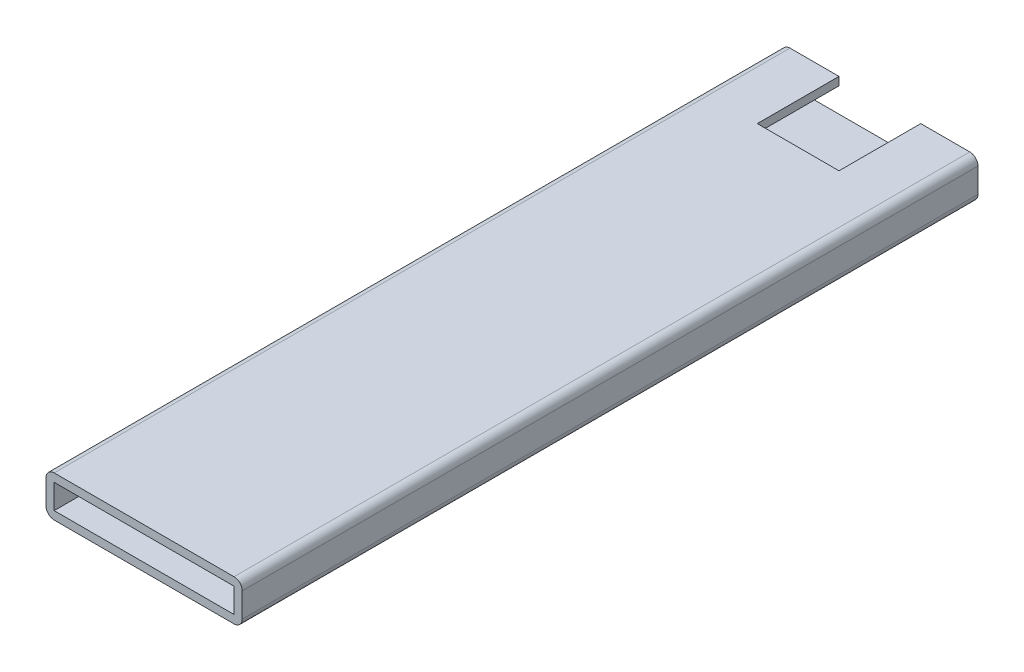
ISO-10303-21;
HEADER;
FILE_DESCRIPTION(('STEP AP214'),'2;1');
FILE_NAME('part.step','',(''),(''),'','','');
FILE_SCHEMA(('AUTOMOTIVE_DESIGN { 1 0 10303 214 1 1 1 1 }'));
ENDSEC;
DATA;
#1=APPLICATION_CONTEXT('core data for automotive mechanical design processes');
#2=APPLICATION_PROTOCOL_DEFINITION('international standard','automotive_design',2000,#1);
#3=PRODUCT_CONTEXT('',#1,'mechanical');
#4=PRODUCT('Part','Part','',(#3));
#5=PRODUCT_RELATED_PRODUCT_CATEGORY('part','',(#4));
#6=PRODUCT_DEFINITION_FORMATION('','',#4);
#7=PRODUCT_DEFINITION_CONTEXT('part definition',#1,'design');
#8=PRODUCT_DEFINITION('design','',#6,#7);
#9=PRODUCT_DEFINITION_SHAPE('','',#8);
#10=(LENGTH_UNIT() NAMED_UNIT(*) SI_UNIT(.MILLI.,.METRE.));
#11=(NAMED_UNIT(*) PLANE_ANGLE_UNIT() SI_UNIT($,.RADIAN.));
#12=(NAMED_UNIT(*) SI_UNIT($,.STERADIAN.) SOLID_ANGLE_UNIT());
#13=UNCERTAINTY_MEASURE_WITH_UNIT(LENGTH_MEASURE(1.E-05),#10,'distance_accuracy_value','');
#14=(GEOMETRIC_REPRESENTATION_CONTEXT(3) GLOBAL_UNCERTAINTY_ASSIGNED_CONTEXT((#13)) GLOBAL_UNIT_ASSIGNED_CONTEXT((#10,
#11,#12)) REPRESENTATION_CONTEXT('',''));
#15=CARTESIAN_POINT('',(0.,0.,0.));
#16=DIRECTION('',(0.,0.,1.));
#17=DIRECTION('',(1.,0.,0.));
#18=AXIS2_PLACEMENT_3D('',#15,#16,#17);
#19=CARTESIAN_POINT('',(22.,0.,90.));
#20=DIRECTION('',(0.,0.,1.));
#21=DIRECTION('',(1.,0.,0.));
#22=AXIS2_PLACEMENT_3D('',#19,#20,#21);
#23=PLANE('',#22);
#24=CARTESIAN_POINT('',(22.,0.,90.));
#25=DIRECTION('',(0.,0.,1.));
#26=DIRECTION('',(1.,0.,0.));
#27=AXIS2_PLACEMENT_3D('',#24,#25,#26);
#28=CIRCLE('',#27,1.);
#29=CARTESIAN_POINT('',(22.,-1.,90.));
#30=VERTEX_POINT('',#29);
#31=CARTESIAN_POINT('',(23.,0.,90.));
#32=VERTEX_POINT('',#31);
#33=EDGE_CURVE('E209',#30,#32,#28,.T.);
#34=ORIENTED_EDGE('',*,*,#33,.T.);
#35=DIRECTION('',(0.,1.,0.));
#36=VECTOR('',#35,1.);
#37=CARTESIAN_POINT('',(23.,2.99999999999999,90.));
#38=LINE('',#37,#36);
#39=CARTESIAN_POINT('',(23.,2.99999999999999,90.));
#40=VERTEX_POINT('',#39);
#41=EDGE_CURVE('E213',#32,#40,#38,.T.);
#42=ORIENTED_EDGE('',*,*,#41,.T.);
#43=CARTESIAN_POINT('',(22.,3.,90.));
#44=DIRECTION('',(0.,0.,1.));
#45=DIRECTION('',(-1.,0.,0.));
#46=AXIS2_PLACEMENT_3D('',#43,#44,#45);
#47=CIRCLE('',#46,1.);
#48=CARTESIAN_POINT('',(22.,4.,90.));
#49=VERTEX_POINT('',#48);
#50=EDGE_CURVE('E217',#40,#49,#47,.T.);
#51=ORIENTED_EDGE('',*,*,#50,.T.);
#52=DIRECTION('',(-1.,0.,0.));
#53=VECTOR('',#52,1.);
#54=CARTESIAN_POINT('',(0.,4.,90.));
#55=LINE('',#54,#53);
#56=CARTESIAN_POINT('',(0.,4.,90.));
#57=VERTEX_POINT('',#56);
#58=EDGE_CURVE('E220',#49,#57,#55,.T.);
#59=ORIENTED_EDGE('',*,*,#58,.T.);
#60=CARTESIAN_POINT('',(0.,3.,90.));
#61=DIRECTION('',(0.,0.,1.));
#62=DIRECTION('',(1.,0.,0.));
#63=AXIS2_PLACEMENT_3D('',#60,#61,#62);
#64=CIRCLE('',#63,1.);
#65=CARTESIAN_POINT('',(-1.,2.99999999999999,90.));
#66=VERTEX_POINT('',#65);
#67=EDGE_CURVE('E223',#57,#66,#64,.T.);
#68=ORIENTED_EDGE('',*,*,#67,.T.);
#69=DIRECTION('',(0.,-1.,0.));
#70=VECTOR('',#69,1.);
#71=CARTESIAN_POINT('',(-1.,2.99999999999999,90.));
#72=LINE('',#71,#70);
#73=CARTESIAN_POINT('',(-1.,0.,90.));
#74=VERTEX_POINT('',#73);
#75=EDGE_CURVE('E226',#66,#74,#72,.T.);
#76=ORIENTED_EDGE('',*,*,#75,.T.);
#77=CARTESIAN_POINT('',(0.,0.,90.));
#78=DIRECTION('',(0.,0.,1.));
#79=DIRECTION('',(1.,0.,0.));
#80=AXIS2_PLACEMENT_3D('',#77,#78,#79);
#81=CIRCLE('',#80,1.);
#82=CARTESIAN_POINT('',(0.,-1.,90.));
#83=VERTEX_POINT('',#82);
#84=EDGE_CURVE('E229',#74,#83,#81,.T.);
#85=ORIENTED_EDGE('',*,*,#84,.T.);
#86=DIRECTION('',(1.,0.,0.));
#87=VECTOR('',#86,1.);
#88=CARTESIAN_POINT('',(0.,-1.,90.));
#89=LINE('',#88,#87);
#90=EDGE_CURVE('E232',#83,#30,#89,.T.);
#91=ORIENTED_EDGE('',*,*,#90,.T.);
#92=EDGE_LOOP('',(#34,#42,#51,#59,#68,#76,#85,#91));
#93=FACE_BOUND('',#92,.T.);
#94=DIRECTION('',(1.,0.,0.));
#95=VECTOR('',#94,1.);
#96=CARTESIAN_POINT('',(0.,0.,90.));
#97=LINE('',#96,#95);
#98=CARTESIAN_POINT('',(0.,0.,90.));
#99=VERTEX_POINT('',#98);
#100=CARTESIAN_POINT('',(22.,0.,90.));
#101=VERTEX_POINT('',#100);
#102=EDGE_CURVE('E525',#99,#101,#97,.T.);
#103=ORIENTED_EDGE('',*,*,#102,.F.);
#104=DIRECTION('',(0.,-1.,0.));
#105=VECTOR('',#104,1.);
#106=CARTESIAN_POINT('',(0.,0.,90.));
#107=LINE('',#106,#105);
#108=CARTESIAN_POINT('',(0.,3.,90.));
#109=VERTEX_POINT('',#108);
#110=EDGE_CURVE('E190',#109,#99,#107,.T.);
#111=ORIENTED_EDGE('',*,*,#110,.F.);
#112=DIRECTION('',(-1.,0.,0.));
#113=VECTOR('',#112,1.);
#114=CARTESIAN_POINT('',(0.,3.,90.));
#115=LINE('',#114,#113);
#116=CARTESIAN_POINT('',(22.,3.,90.));
#117=VERTEX_POINT('',#116);
#118=EDGE_CURVE('E198',#117,#109,#115,.T.);
#119=ORIENTED_EDGE('',*,*,#118,.F.);
#120=DIRECTION('',(0.,1.,0.));
#121=VECTOR('',#120,1.);
#122=CARTESIAN_POINT('',(22.,0.,90.));
#123=LINE('',#122,#121);
#124=EDGE_CURVE('E528',#101,#117,#123,.T.);
#125=ORIENTED_EDGE('',*,*,#124,.F.);
#126=EDGE_LOOP('',(#103,#111,#119,#125));
#127=FACE_BOUND('',#126,.T.);
#128=ADVANCED_FACE('F43',(#93,#127),#23,.T.);
#129=CARTESIAN_POINT('',(22.,0.,0.));
#130=DIRECTION('',(0.,0.,1.));
#131=DIRECTION('',(1.,0.,0.));
#132=AXIS2_PLACEMENT_3D('',#129,#130,#131);
#133=PLANE('',#132);
#134=DIRECTION('',(-1.,0.,0.));
#135=VECTOR('',#134,1.);
#136=CARTESIAN_POINT('',(0.,3.,0.));
#137=LINE('',#136,#135);
#138=CARTESIAN_POINT('',(22.,3.,0.));
#139=VERTEX_POINT('',#138);
#140=CARTESIAN_POINT('',(16.,3.,0.));
#141=VERTEX_POINT('',#140);
#142=EDGE_CURVE('E185',#139,#141,#137,.T.);
#143=ORIENTED_EDGE('',*,*,#142,.T.);
#144=DIRECTION('',(0.,1.,0.));
#145=VECTOR('',#144,1.);
#146=CARTESIAN_POINT('',(16.,3.,0.));
#147=LINE('',#146,#145);
#148=CARTESIAN_POINT('',(16.,4.,0.));
#149=VERTEX_POINT('',#148);
#150=EDGE_CURVE('E294',#141,#149,#147,.T.);
#151=ORIENTED_EDGE('',*,*,#150,.T.);
#152=DIRECTION('',(-1.,0.,0.));
#153=VECTOR('',#152,1.);
#154=CARTESIAN_POINT('',(0.,4.,0.));
#155=LINE('',#154,#153);
#156=CARTESIAN_POINT('',(22.,4.,0.));
#157=VERTEX_POINT('',#156);
#158=EDGE_CURVE('E245',#157,#149,#155,.T.);
#159=ORIENTED_EDGE('',*,*,#158,.F.);
#160=CARTESIAN_POINT('',(22.,3.,0.));
#161=DIRECTION('',(0.,0.,1.));
#162=DIRECTION('',(-1.,0.,0.));
#163=AXIS2_PLACEMENT_3D('',#160,#161,#162);
#164=CIRCLE('',#163,1.);
#165=CARTESIAN_POINT('',(23.,2.99999999999999,0.));
#166=VERTEX_POINT('',#165);
#167=EDGE_CURVE('E242',#166,#157,#164,.T.);
#168=ORIENTED_EDGE('',*,*,#167,.F.);
#169=DIRECTION('',(0.,1.,0.));
#170=VECTOR('',#169,1.);
#171=CARTESIAN_POINT('',(23.,2.99999999999999,0.));
#172=LINE('',#171,#170);
#173=CARTESIAN_POINT('',(23.,0.,0.));
#174=VERTEX_POINT('',#173);
#175=EDGE_CURVE('E239',#174,#166,#172,.T.);
#176=ORIENTED_EDGE('',*,*,#175,.F.);
#177=CARTESIAN_POINT('',(22.,0.,0.));
#178=DIRECTION('',(0.,0.,1.));
#179=DIRECTION('',(1.,0.,0.));
#180=AXIS2_PLACEMENT_3D('',#177,#178,#179);
#181=CIRCLE('',#180,1.);
#182=CARTESIAN_POINT('',(22.,-1.,0.));
#183=VERTEX_POINT('',#182);
#184=EDGE_CURVE('E208',#183,#174,#181,.T.);
#185=ORIENTED_EDGE('',*,*,#184,.F.);
#186=DIRECTION('',(1.,0.,0.));
#187=VECTOR('',#186,1.);
#188=CARTESIAN_POINT('',(0.,-1.,0.));
#189=LINE('',#188,#187);
#190=CARTESIAN_POINT('',(0.,-1.,0.));
#191=VERTEX_POINT('',#190);
#192=EDGE_CURVE('E214',#191,#183,#189,.T.);
#193=ORIENTED_EDGE('',*,*,#192,.F.);
#194=CARTESIAN_POINT('',(0.,0.,0.));
#195=DIRECTION('',(0.,0.,1.));
#196=DIRECTION('',(1.,0.,0.));
#197=AXIS2_PLACEMENT_3D('',#194,#195,#196);
#198=CIRCLE('',#197,1.);
#199=CARTESIAN_POINT('',(-1.,0.,0.));
#200=VERTEX_POINT('',#199);
#201=EDGE_CURVE('E255',#200,#191,#198,.T.);
#202=ORIENTED_EDGE('',*,*,#201,.F.);
#203=DIRECTION('',(0.,-1.,0.));
#204=VECTOR('',#203,1.);
#205=CARTESIAN_POINT('',(-1.,2.99999999999999,0.));
#206=LINE('',#205,#204);
#207=CARTESIAN_POINT('',(-1.,2.99999999999999,0.));
#208=VERTEX_POINT('',#207);
#209=EDGE_CURVE('E252',#208,#200,#206,.T.);
#210=ORIENTED_EDGE('',*,*,#209,.F.);
#211=CARTESIAN_POINT('',(0.,3.,0.));
#212=DIRECTION('',(0.,0.,1.));
#213=DIRECTION('',(1.,0.,0.));
#214=AXIS2_PLACEMENT_3D('',#211,#212,#213);
#215=CIRCLE('',#214,1.);
#216=CARTESIAN_POINT('',(0.,4.,0.));
#217=VERTEX_POINT('',#216);
#218=EDGE_CURVE('E249',#217,#208,#215,.T.);
#219=ORIENTED_EDGE('',*,*,#218,.F.);
#220=CARTESIAN_POINT('',(6.00000000000001,4.,0.));
#221=VERTEX_POINT('',#220);
#222=EDGE_CURVE('E175',#221,#217,#155,.T.);
#223=ORIENTED_EDGE('',*,*,#222,.F.);
#224=DIRECTION('',(0.,1.,0.));
#225=VECTOR('',#224,1.);
#226=CARTESIAN_POINT('',(6.00000000000001,3.,0.));
#227=LINE('',#226,#225);
#228=CARTESIAN_POINT('',(6.00000000000001,3.,0.));
#229=VERTEX_POINT('',#228);
#230=EDGE_CURVE('E160',#229,#221,#227,.T.);
#231=ORIENTED_EDGE('',*,*,#230,.F.);
#232=CARTESIAN_POINT('',(0.,3.,0.));
#233=VERTEX_POINT('',#232);
#234=EDGE_CURVE('E172',#229,#233,#137,.T.);
#235=ORIENTED_EDGE('',*,*,#234,.T.);
#236=DIRECTION('',(0.,-1.,0.));
#237=VECTOR('',#236,1.);
#238=CARTESIAN_POINT('',(0.,0.,0.));
#239=LINE('',#238,#237);
#240=CARTESIAN_POINT('',(0.,0.,0.));
#241=VERTEX_POINT('',#240);
#242=EDGE_CURVE('E518',#233,#241,#239,.T.);
#243=ORIENTED_EDGE('',*,*,#242,.T.);
#244=DIRECTION('',(1.,0.,0.));
#245=VECTOR('',#244,1.);
#246=CARTESIAN_POINT('',(0.,0.,0.));
#247=LINE('',#246,#245);
#248=CARTESIAN_POINT('',(22.,0.,0.));
#249=VERTEX_POINT('',#248);
#250=EDGE_CURVE('E192',#241,#249,#247,.T.);
#251=ORIENTED_EDGE('',*,*,#250,.T.);
#252=DIRECTION('',(0.,1.,0.));
#253=VECTOR('',#252,1.);
#254=CARTESIAN_POINT('',(22.,0.,0.));
#255=LINE('',#254,#253);
#256=EDGE_CURVE('E186',#249,#139,#255,.T.);
#257=ORIENTED_EDGE('',*,*,#256,.T.);
#258=EDGE_LOOP('',(#143,#151,#159,#168,#176,#185,#193,#202,#210,#219,#223,#231,#235,#243,#251,#257));
#259=FACE_BOUND('',#258,.T.);
#260=ADVANCED_FACE('F170',(#259),#133,.F.);
#261=CARTESIAN_POINT('',(22.,0.,90.));
#262=DIRECTION('',(0.,0.,-1.));
#263=DIRECTION('',(-1.,0.,0.));
#264=AXIS2_PLACEMENT_3D('',#261,#262,#263);
#265=CYLINDRICAL_SURFACE('',#264,1.);
#266=ORIENTED_EDGE('',*,*,#184,.T.);
#267=DIRECTION('',(0.,0.,-1.));
#268=VECTOR('',#267,1.);
#269=CARTESIAN_POINT('',(23.,0.,90.));
#270=LINE('',#269,#268);
#271=EDGE_CURVE('E11',#32,#174,#270,.T.);
#272=ORIENTED_EDGE('',*,*,#271,.F.);
#273=ORIENTED_EDGE('',*,*,#33,.F.);
#274=DIRECTION('',(0.,0.,-1.));
#275=VECTOR('',#274,1.);
#276=CARTESIAN_POINT('',(22.,-1.,90.));
#277=LINE('',#276,#275);
#278=EDGE_CURVE('E235',#30,#183,#277,.T.);
#279=ORIENTED_EDGE('',*,*,#278,.T.);
#280=EDGE_LOOP('',(#266,#272,#273,#279));
#281=FACE_BOUND('',#280,.T.);
#282=ADVANCED_FACE('F45',(#281),#265,.T.);
#283=CARTESIAN_POINT('',(23.,2.99999999999999,90.));
#284=DIRECTION('',(-1.,0.,0.));
#285=DIRECTION('',(0.,-1.,0.));
#286=AXIS2_PLACEMENT_3D('',#283,#284,#285);
#287=PLANE('',#286);
#288=ORIENTED_EDGE('',*,*,#175,.T.);
#289=DIRECTION('',(0.,0.,-1.));
#290=VECTOR('',#289,1.);
#291=CARTESIAN_POINT('',(23.,2.99999999999999,90.));
#292=LINE('',#291,#290);
#293=EDGE_CURVE('E52',#40,#166,#292,.T.);
#294=ORIENTED_EDGE('',*,*,#293,.F.);
#295=ORIENTED_EDGE('',*,*,#41,.F.);
#296=ORIENTED_EDGE('',*,*,#271,.T.);
#297=EDGE_LOOP('',(#288,#294,#295,#296));
#298=FACE_BOUND('',#297,.T.);
#299=ADVANCED_FACE('F307',(#298),#287,.F.);
#300=CARTESIAN_POINT('',(22.,3.,90.));
#301=DIRECTION('',(0.,0.,-1.));
#302=DIRECTION('',(-1.,0.,0.));
#303=AXIS2_PLACEMENT_3D('',#300,#301,#302);
#304=CYLINDRICAL_SURFACE('',#303,1.);
#305=ORIENTED_EDGE('',*,*,#167,.T.);
#306=DIRECTION('',(0.,0.,-1.));
#307=VECTOR('',#306,1.);
#308=CARTESIAN_POINT('',(22.,4.,90.));
#309=LINE('',#308,#307);
#310=EDGE_CURVE('E279',#49,#157,#309,.T.);
#311=ORIENTED_EDGE('',*,*,#310,.F.);
#312=ORIENTED_EDGE('',*,*,#50,.F.);
#313=ORIENTED_EDGE('',*,*,#293,.T.);
#314=EDGE_LOOP('',(#305,#311,#312,#313));
#315=FACE_BOUND('',#314,.T.);
#316=ADVANCED_FACE('F288',(#315),#304,.T.);
#317=CARTESIAN_POINT('',(0.,4.,90.));
#318=DIRECTION('',(0.,-1.,0.));
#319=DIRECTION('',(0.,0.,-1.));
#320=AXIS2_PLACEMENT_3D('',#317,#318,#319);
#321=PLANE('',#320);
#322=ORIENTED_EDGE('',*,*,#158,.T.);
#323=DIRECTION('',(0.,0.,-1.));
#324=VECTOR('',#323,1.);
#325=CARTESIAN_POINT('',(16.,4.,10.));
#326=LINE('',#325,#324);
#327=CARTESIAN_POINT('',(16.,4.,10.));
#328=VERTEX_POINT('',#327);
#329=EDGE_CURVE('E165',#328,#149,#326,.T.);
#330=ORIENTED_EDGE('',*,*,#329,.F.);
#331=DIRECTION('',(1.,0.,0.));
#332=VECTOR('',#331,1.);
#333=CARTESIAN_POINT('',(6.00000000000001,4.,10.));
#334=LINE('',#333,#332);
#335=CARTESIAN_POINT('',(6.00000000000001,4.,10.));
#336=VERTEX_POINT('',#335);
#337=EDGE_CURVE('E504',#336,#328,#334,.T.);
#338=ORIENTED_EDGE('',*,*,#337,.F.);
#339=DIRECTION('',(0.,0.,1.));
#340=VECTOR('',#339,1.);
#341=CARTESIAN_POINT('',(6.00000000000001,4.,0.));
#342=LINE('',#341,#340);
#343=EDGE_CURVE('E508',#221,#336,#342,.T.);
#344=ORIENTED_EDGE('',*,*,#343,.F.);
#345=ORIENTED_EDGE('',*,*,#222,.T.);
#346=DIRECTION('',(0.,0.,-1.));
#347=VECTOR('',#346,1.);
#348=CARTESIAN_POINT('',(0.,4.,90.));
#349=LINE('',#348,#347);
#350=EDGE_CURVE('E275',#57,#217,#349,.T.);
#351=ORIENTED_EDGE('',*,*,#350,.F.);
#352=ORIENTED_EDGE('',*,*,#58,.F.);
#353=ORIENTED_EDGE('',*,*,#310,.T.);
#354=EDGE_LOOP('',(#322,#330,#338,#344,#345,#351,#352,#353));
#355=FACE_BOUND('',#354,.T.);
#356=ADVANCED_FACE('F297',(#355),#321,.F.);
#357=CARTESIAN_POINT('',(0.,3.,90.));
#358=DIRECTION('',(0.,0.,-1.));
#359=DIRECTION('',(-1.,0.,0.));
#360=AXIS2_PLACEMENT_3D('',#357,#358,#359);
#361=CYLINDRICAL_SURFACE('',#360,1.);
#362=ORIENTED_EDGE('',*,*,#218,.T.);
#363=DIRECTION('',(0.,0.,-1.));
#364=VECTOR('',#363,1.);
#365=CARTESIAN_POINT('',(-1.,2.99999999999999,90.));
#366=LINE('',#365,#364);
#367=EDGE_CURVE('E271',#66,#208,#366,.T.);
#368=ORIENTED_EDGE('',*,*,#367,.F.);
#369=ORIENTED_EDGE('',*,*,#67,.F.);
#370=ORIENTED_EDGE('',*,*,#350,.T.);
#371=EDGE_LOOP('',(#362,#368,#369,#370));
#372=FACE_BOUND('',#371,.T.);
#373=ADVANCED_FACE('F325',(#372),#361,.T.);
#374=CARTESIAN_POINT('',(-1.,2.99999999999999,90.));
#375=DIRECTION('',(1.,0.,0.));
#376=DIRECTION('',(0.,1.,0.));
#377=AXIS2_PLACEMENT_3D('',#374,#375,#376);
#378=PLANE('',#377);
#379=ORIENTED_EDGE('',*,*,#209,.T.);
#380=DIRECTION('',(0.,0.,-1.));
#381=VECTOR('',#380,1.);
#382=CARTESIAN_POINT('',(-1.,0.,90.));
#383=LINE('',#382,#381);
#384=EDGE_CURVE('E267',#74,#200,#383,.T.);
#385=ORIENTED_EDGE('',*,*,#384,.F.);
#386=ORIENTED_EDGE('',*,*,#75,.F.);
#387=ORIENTED_EDGE('',*,*,#367,.T.);
#388=EDGE_LOOP('',(#379,#385,#386,#387));
#389=FACE_BOUND('',#388,.T.);
#390=ADVANCED_FACE('F323',(#389),#378,.F.);
#391=CARTESIAN_POINT('',(0.,0.,90.));
#392=DIRECTION('',(0.,0.,-1.));
#393=DIRECTION('',(-1.,0.,0.));
#394=AXIS2_PLACEMENT_3D('',#391,#392,#393);
#395=CYLINDRICAL_SURFACE('',#394,1.);
#396=ORIENTED_EDGE('',*,*,#201,.T.);
#397=DIRECTION('',(0.,0.,-1.));
#398=VECTOR('',#397,1.);
#399=CARTESIAN_POINT('',(0.,-1.,90.));
#400=LINE('',#399,#398);
#401=EDGE_CURVE('E263',#83,#191,#400,.T.);
#402=ORIENTED_EDGE('',*,*,#401,.F.);
#403=ORIENTED_EDGE('',*,*,#84,.F.);
#404=ORIENTED_EDGE('',*,*,#384,.T.);
#405=EDGE_LOOP('',(#396,#402,#403,#404));
#406=FACE_BOUND('',#405,.T.);
#407=ADVANCED_FACE('F319',(#406),#395,.T.);
#408=CARTESIAN_POINT('',(0.,-1.,90.));
#409=DIRECTION('',(0.,1.,0.));
#410=DIRECTION('',(0.,0.,1.));
#411=AXIS2_PLACEMENT_3D('',#408,#409,#410);
#412=PLANE('',#411);
#413=ORIENTED_EDGE('',*,*,#192,.T.);
#414=ORIENTED_EDGE('',*,*,#278,.F.);
#415=ORIENTED_EDGE('',*,*,#90,.F.);
#416=ORIENTED_EDGE('',*,*,#401,.T.);
#417=EDGE_LOOP('',(#413,#414,#415,#416));
#418=FACE_BOUND('',#417,.T.);
#419=ADVANCED_FACE('F314',(#418),#412,.F.);
#420=CARTESIAN_POINT('',(0.,0.,90.));
#421=DIRECTION('',(1.,0.,0.));
#422=DIRECTION('',(0.,0.,-1.));
#423=AXIS2_PLACEMENT_3D('',#420,#421,#422);
#424=PLANE('',#423);
#425=ORIENTED_EDGE('',*,*,#242,.F.);
#426=DIRECTION('',(0.,0.,-1.));
#427=VECTOR('',#426,1.);
#428=CARTESIAN_POINT('',(0.,3.,90.));
#429=LINE('',#428,#427);
#430=EDGE_CURVE('E183',#109,#233,#429,.T.);
#431=ORIENTED_EDGE('',*,*,#430,.F.);
#432=ORIENTED_EDGE('',*,*,#110,.T.);
#433=DIRECTION('',(0.,0.,-1.));
#434=VECTOR('',#433,1.);
#435=CARTESIAN_POINT('',(0.,0.,90.));
#436=LINE('',#435,#434);
#437=EDGE_CURVE('E204',#99,#241,#436,.T.);
#438=ORIENTED_EDGE('',*,*,#437,.T.);
#439=EDGE_LOOP('',(#425,#431,#432,#438));
#440=FACE_BOUND('',#439,.T.);
#441=ADVANCED_FACE('F341',(#440),#424,.T.);
#442=CARTESIAN_POINT('',(0.,0.,90.));
#443=DIRECTION('',(0.,1.,0.));
#444=DIRECTION('',(0.,0.,1.));
#445=AXIS2_PLACEMENT_3D('',#442,#443,#444);
#446=PLANE('',#445);
#447=ORIENTED_EDGE('',*,*,#250,.F.);
#448=ORIENTED_EDGE('',*,*,#437,.F.);
#449=ORIENTED_EDGE('',*,*,#102,.T.);
#450=DIRECTION('',(0.,0.,-1.));
#451=VECTOR('',#450,1.);
#452=CARTESIAN_POINT('',(22.,0.,90.));
#453=LINE('',#452,#451);
#454=EDGE_CURVE('E201',#101,#249,#453,.T.);
#455=ORIENTED_EDGE('',*,*,#454,.T.);
#456=EDGE_LOOP('',(#447,#448,#449,#455));
#457=FACE_BOUND('',#456,.T.);
#458=ADVANCED_FACE('F361',(#457),#446,.T.);
#459=CARTESIAN_POINT('',(22.,0.,90.));
#460=DIRECTION('',(-1.,0.,0.));
#461=DIRECTION('',(0.,0.,1.));
#462=AXIS2_PLACEMENT_3D('',#459,#460,#461);
#463=PLANE('',#462);
#464=ORIENTED_EDGE('',*,*,#256,.F.);
#465=ORIENTED_EDGE('',*,*,#454,.F.);
#466=ORIENTED_EDGE('',*,*,#124,.T.);
#467=DIRECTION('',(0.,0.,-1.));
#468=VECTOR('',#467,1.);
#469=CARTESIAN_POINT('',(22.,3.,90.));
#470=LINE('',#469,#468);
#471=EDGE_CURVE('E67',#117,#139,#470,.T.);
#472=ORIENTED_EDGE('',*,*,#471,.T.);
#473=EDGE_LOOP('',(#464,#465,#466,#472));
#474=FACE_BOUND('',#473,.T.);
#475=ADVANCED_FACE('F368',(#474),#463,.T.);
#476=CARTESIAN_POINT('',(0.,3.,90.));
#477=DIRECTION('',(0.,-1.,0.));
#478=DIRECTION('',(0.,0.,-1.));
#479=AXIS2_PLACEMENT_3D('',#476,#477,#478);
#480=PLANE('',#479);
#481=DIRECTION('',(0.,0.,-1.));
#482=VECTOR('',#481,1.);
#483=CARTESIAN_POINT('',(16.,3.,10.));
#484=LINE('',#483,#482);
#485=CARTESIAN_POINT('',(16.,3.,10.));
#486=VERTEX_POINT('',#485);
#487=EDGE_CURVE('E177',#486,#141,#484,.T.);
#488=ORIENTED_EDGE('',*,*,#487,.T.);
#489=ORIENTED_EDGE('',*,*,#142,.F.);
#490=ORIENTED_EDGE('',*,*,#471,.F.);
#491=ORIENTED_EDGE('',*,*,#118,.T.);
#492=ORIENTED_EDGE('',*,*,#430,.T.);
#493=ORIENTED_EDGE('',*,*,#234,.F.);
#494=DIRECTION('',(0.,0.,1.));
#495=VECTOR('',#494,1.);
#496=CARTESIAN_POINT('',(6.00000000000001,3.,0.));
#497=LINE('',#496,#495);
#498=CARTESIAN_POINT('',(6.00000000000001,3.,9.99999999999999));
#499=VERTEX_POINT('',#498);
#500=EDGE_CURVE('E156',#229,#499,#497,.T.);
#501=ORIENTED_EDGE('',*,*,#500,.T.);
#502=DIRECTION('',(1.,0.,0.));
#503=VECTOR('',#502,1.);
#504=CARTESIAN_POINT('',(6.00000000000001,3.,10.));
#505=LINE('',#504,#503);
#506=EDGE_CURVE('E59',#499,#486,#505,.T.);
#507=ORIENTED_EDGE('',*,*,#506,.T.);
#508=EDGE_LOOP('',(#488,#489,#490,#491,#492,#493,#501,#507));
#509=FACE_BOUND('',#508,.T.);
#510=ADVANCED_FACE('F181',(#509),#480,.T.);
#511=CARTESIAN_POINT('',(16.,3.,10.));
#512=DIRECTION('',(1.,0.,0.));
#513=DIRECTION('',(0.,0.,-1.));
#514=AXIS2_PLACEMENT_3D('',#511,#512,#513);
#515=PLANE('',#514);
#516=ORIENTED_EDGE('',*,*,#329,.T.);
#517=ORIENTED_EDGE('',*,*,#150,.F.);
#518=ORIENTED_EDGE('',*,*,#487,.F.);
#519=DIRECTION('',(0.,1.,0.));
#520=VECTOR('',#519,1.);
#521=CARTESIAN_POINT('',(16.,3.,10.));
#522=LINE('',#521,#520);
#523=EDGE_CURVE('E505',#486,#328,#522,.T.);
#524=ORIENTED_EDGE('',*,*,#523,.T.);
#525=EDGE_LOOP('',(#516,#517,#518,#524));
#526=FACE_BOUND('',#525,.T.);
#527=ADVANCED_FACE('F383',(#526),#515,.F.);
#528=CARTESIAN_POINT('',(6.00000000000001,3.,10.));
#529=DIRECTION('',(0.,0.,1.));
#530=DIRECTION('',(1.,0.,0.));
#531=AXIS2_PLACEMENT_3D('',#528,#529,#530);
#532=PLANE('',#531);
#533=ORIENTED_EDGE('',*,*,#337,.T.);
#534=ORIENTED_EDGE('',*,*,#523,.F.);
#535=ORIENTED_EDGE('',*,*,#506,.F.);
#536=DIRECTION('',(0.,1.,0.));
#537=VECTOR('',#536,1.);
#538=CARTESIAN_POINT('',(6.00000000000001,3.,10.));
#539=LINE('',#538,#537);
#540=EDGE_CURVE('E162',#499,#336,#539,.T.);
#541=ORIENTED_EDGE('',*,*,#540,.T.);
#542=EDGE_LOOP('',(#533,#534,#535,#541));
#543=FACE_BOUND('',#542,.T.);
#544=ADVANCED_FACE('F391',(#543),#532,.F.);
#545=CARTESIAN_POINT('',(6.00000000000001,3.,0.));
#546=DIRECTION('',(-1.,0.,0.));
#547=DIRECTION('',(0.,0.,1.));
#548=AXIS2_PLACEMENT_3D('',#545,#546,#547);
#549=PLANE('',#548);
#550=ORIENTED_EDGE('',*,*,#343,.T.);
#551=ORIENTED_EDGE('',*,*,#540,.F.);
#552=ORIENTED_EDGE('',*,*,#500,.F.);
#553=ORIENTED_EDGE('',*,*,#230,.T.);
#554=EDGE_LOOP('',(#550,#551,#552,#553));
#555=FACE_BOUND('',#554,.T.);
#556=ADVANCED_FACE('F159',(#555),#549,.F.);
#557=CLOSED_SHELL('',(#128,#260,#282,#299,#316,#356,#373,#390,#407,#419,#441,#458,#475,#510,
#527,#544,#556));
#558=MANIFOLD_SOLID_BREP('B2',#557);
#559=ADVANCED_BREP_SHAPE_REPRESENTATION('',(#18,#558),#14);
#560=SHAPE_DEFINITION_REPRESENTATION(#9,#559);
ENDSEC;
END-ISO-10303-21;
